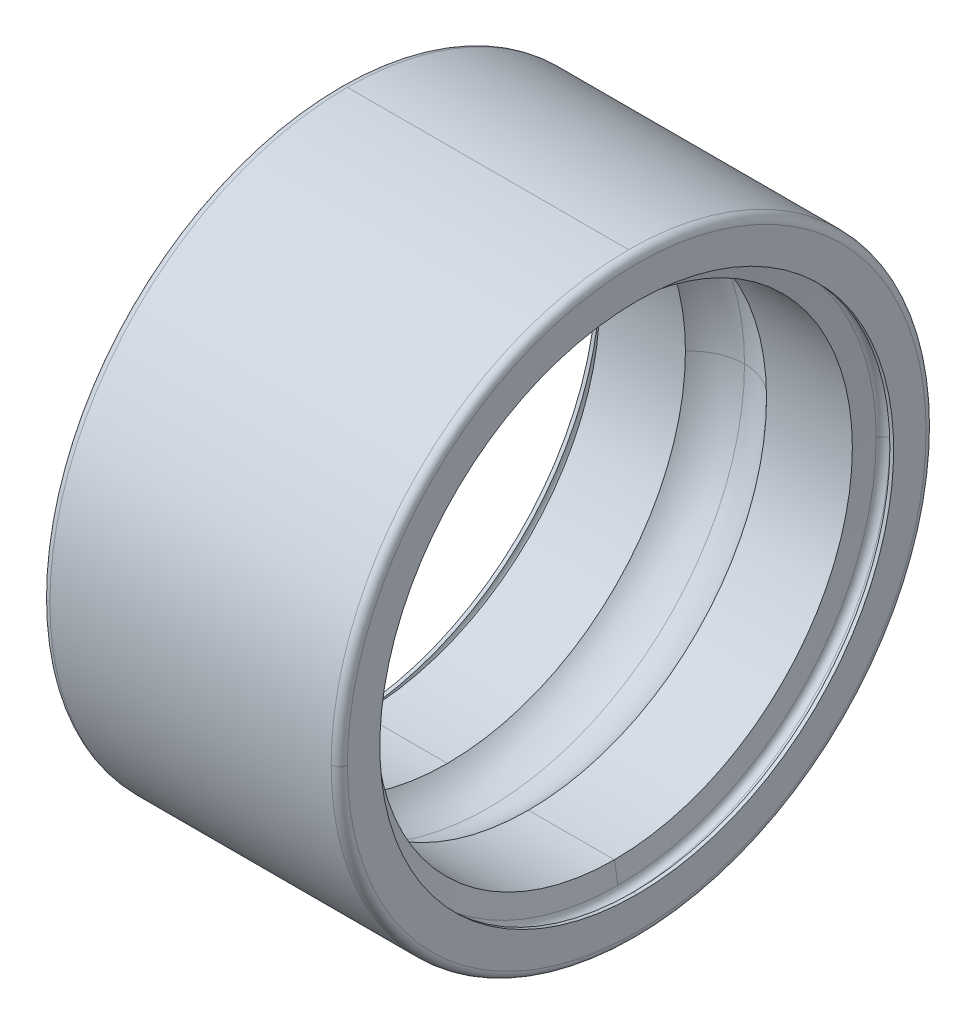
ISO-10303-21;
HEADER;
FILE_DESCRIPTION(('STEP AP214'),'2;1');
FILE_NAME('part.step','',(''),(''),'','','');
FILE_SCHEMA(('AUTOMOTIVE_DESIGN { 1 0 10303 214 1 1 1 1 }'));
ENDSEC;
DATA;
#1=APPLICATION_CONTEXT('core data for automotive mechanical design processes');
#2=APPLICATION_PROTOCOL_DEFINITION('international standard','automotive_design',2000,#1);
#3=PRODUCT_CONTEXT('',#1,'mechanical');
#4=PRODUCT('Part','Part','',(#3));
#5=PRODUCT_RELATED_PRODUCT_CATEGORY('part','',(#4));
#6=PRODUCT_DEFINITION_FORMATION('','',#4);
#7=PRODUCT_DEFINITION_CONTEXT('part definition',#1,'design');
#8=PRODUCT_DEFINITION('design','',#6,#7);
#9=PRODUCT_DEFINITION_SHAPE('','',#8);
#10=(LENGTH_UNIT() NAMED_UNIT(*) SI_UNIT(.MILLI.,.METRE.));
#11=(NAMED_UNIT(*) PLANE_ANGLE_UNIT() SI_UNIT($,.RADIAN.));
#12=(NAMED_UNIT(*) SI_UNIT($,.STERADIAN.) SOLID_ANGLE_UNIT());
#13=UNCERTAINTY_MEASURE_WITH_UNIT(LENGTH_MEASURE(1.E-05),#10,'distance_accuracy_value','');
#14=(GEOMETRIC_REPRESENTATION_CONTEXT(3) GLOBAL_UNCERTAINTY_ASSIGNED_CONTEXT((#13)) GLOBAL_UNIT_ASSIGNED_CONTEXT((#10,
#11,#12)) REPRESENTATION_CONTEXT('',''));
#15=CARTESIAN_POINT('',(0.,0.,0.));
#16=DIRECTION('',(0.,0.,1.));
#17=DIRECTION('',(1.,0.,0.));
#18=AXIS2_PLACEMENT_3D('',#15,#16,#17);
#19=CARTESIAN_POINT('',(10.58,0.,0.));
#20=DIRECTION('',(1.,0.,0.));
#21=DIRECTION('',(0.,0.,-1.));
#22=AXIS2_PLACEMENT_3D('',#19,#20,#21);
#23=TOROIDAL_SURFACE('',#22,9.5,0.28);
#24=CARTESIAN_POINT('',(10.58,0.,0.));
#25=DIRECTION('',(1.,0.,0.));
#26=DIRECTION('',(0.,0.,1.));
#27=AXIS2_PLACEMENT_3D('',#24,#25,#26);
#28=CIRCLE('',#27,9.78);
#29=CARTESIAN_POINT('',(10.58,0.,-9.78));
#30=VERTEX_POINT('',#29);
#31=CARTESIAN_POINT('',(10.58,0.,9.78));
#32=VERTEX_POINT('',#31);
#33=EDGE_CURVE('E398',#30,#32,#28,.T.);
#34=ORIENTED_EDGE('',*,*,#33,.T.);
#35=CARTESIAN_POINT('',(10.58,0.,9.5));
#36=DIRECTION('',(0.,-1.,0.));
#37=DIRECTION('',(0.,0.,1.));
#38=AXIS2_PLACEMENT_3D('',#35,#36,#37);
#39=CIRCLE('',#38,0.28);
#40=CARTESIAN_POINT('',(10.3042538291566,0.,9.54862148974674));
#41=VERTEX_POINT('',#40);
#42=EDGE_CURVE('E255',#32,#41,#39,.T.);
#43=ORIENTED_EDGE('',*,*,#42,.T.);
#44=CARTESIAN_POINT('',(10.3042538291566,0.,0.));
#45=DIRECTION('',(1.,0.,0.));
#46=DIRECTION('',(0.,1.,0.));
#47=AXIS2_PLACEMENT_3D('',#44,#45,#46);
#48=CIRCLE('',#47,9.54862148974674);
#49=CARTESIAN_POINT('',(10.3042538291566,9.54862148974674,0.));
#50=VERTEX_POINT('',#49);
#51=EDGE_CURVE('E31',#50,#41,#48,.T.);
#52=ORIENTED_EDGE('',*,*,#51,.F.);
#53=CARTESIAN_POINT('',(10.3042538291566,0.,0.));
#54=DIRECTION('',(1.,0.,0.));
#55=DIRECTION('',(0.,1.,0.));
#56=AXIS2_PLACEMENT_3D('',#53,#54,#55);
#57=CIRCLE('',#56,9.54862148974674);
#58=CARTESIAN_POINT('',(10.3042538291566,0.,-9.54862148974674));
#59=VERTEX_POINT('',#58);
#60=EDGE_CURVE('E201',#59,#50,#57,.T.);
#61=ORIENTED_EDGE('',*,*,#60,.F.);
#62=CARTESIAN_POINT('',(10.58,0.,-9.5));
#63=DIRECTION('',(0.,-1.,0.));
#64=DIRECTION('',(0.,0.,-1.));
#65=AXIS2_PLACEMENT_3D('',#62,#63,#64);
#66=CIRCLE('',#65,0.28);
#67=EDGE_CURVE('E380',#59,#30,#66,.T.);
#68=ORIENTED_EDGE('',*,*,#67,.T.);
#69=EDGE_LOOP('',(#34,#43,#52,#61,#68));
#70=FACE_BOUND('',#69,.T.);
#71=ADVANCED_FACE('F15',(#70),#23,.F.);
#72=CARTESIAN_POINT('',(10.93,0.,0.));
#73=DIRECTION('',(1.,0.,0.));
#74=DIRECTION('',(0.,1.,0.));
#75=AXIS2_PLACEMENT_3D('',#72,#73,#74);
#76=CYLINDRICAL_SURFACE('',#75,9.5);
#77=DIRECTION('',(1.,0.,0.));
#78=VECTOR('',#77,1.);
#79=CARTESIAN_POINT('',(10.93,9.5,0.));
#80=LINE('',#79,#78);
#81=CARTESIAN_POINT('',(10.86,9.5,0.));
#82=VERTEX_POINT('',#81);
#83=CARTESIAN_POINT('',(11.,9.5,0.));
#84=VERTEX_POINT('',#83);
#85=EDGE_CURVE('E257',#82,#84,#80,.T.);
#86=ORIENTED_EDGE('',*,*,#85,.T.);
#87=CARTESIAN_POINT('',(11.,0.,0.));
#88=DIRECTION('',(1.,0.,0.));
#89=DIRECTION('',(0.,1.,0.));
#90=AXIS2_PLACEMENT_3D('',#87,#88,#89);
#91=CIRCLE('',#90,9.5);
#92=CARTESIAN_POINT('',(11.,-9.5,0.));
#93=VERTEX_POINT('',#92);
#94=EDGE_CURVE('E10',#84,#93,#91,.T.);
#95=ORIENTED_EDGE('',*,*,#94,.T.);
#96=DIRECTION('',(-1.,0.,0.));
#97=VECTOR('',#96,1.);
#98=CARTESIAN_POINT('',(10.93,-9.5,0.));
#99=LINE('',#98,#97);
#100=CARTESIAN_POINT('',(10.86,-9.5,0.));
#101=VERTEX_POINT('',#100);
#102=EDGE_CURVE('E259',#93,#101,#99,.T.);
#103=ORIENTED_EDGE('',*,*,#102,.T.);
#104=CARTESIAN_POINT('',(10.86,0.,0.));
#105=DIRECTION('',(1.,0.,0.));
#106=DIRECTION('',(0.,1.,0.));
#107=AXIS2_PLACEMENT_3D('',#104,#105,#106);
#108=CIRCLE('',#107,9.5);
#109=CARTESIAN_POINT('',(10.86,0.,9.5));
#110=VERTEX_POINT('',#109);
#111=EDGE_CURVE('E373',#110,#101,#108,.T.);
#112=ORIENTED_EDGE('',*,*,#111,.F.);
#113=CARTESIAN_POINT('',(10.86,0.,0.));
#114=DIRECTION('',(1.,0.,0.));
#115=DIRECTION('',(0.,1.,0.));
#116=AXIS2_PLACEMENT_3D('',#113,#114,#115);
#117=CIRCLE('',#116,9.5);
#118=EDGE_CURVE('E458',#82,#110,#117,.T.);
#119=ORIENTED_EDGE('',*,*,#118,.F.);
#120=EDGE_LOOP('',(#86,#95,#103,#112,#119));
#121=FACE_BOUND('',#120,.T.);
#122=ADVANCED_FACE('F486',(#121),#76,.F.);
#123=CARTESIAN_POINT('',(11.,10.1,0.));
#124=DIRECTION('',(1.,0.,0.));
#125=DIRECTION('',(0.,1.,0.));
#126=AXIS2_PLACEMENT_3D('',#123,#124,#125);
#127=PLANE('',#126);
#128=ORIENTED_EDGE('',*,*,#94,.F.);
#129=CARTESIAN_POINT('',(11.,0.,0.));
#130=DIRECTION('',(1.,0.,0.));
#131=DIRECTION('',(0.,1.,0.));
#132=AXIS2_PLACEMENT_3D('',#129,#130,#131);
#133=CIRCLE('',#132,9.5);
#134=EDGE_CURVE('E262',#93,#84,#133,.T.);
#135=ORIENTED_EDGE('',*,*,#134,.F.);
#136=EDGE_LOOP('',(#128,#135));
#137=FACE_BOUND('',#136,.T.);
#138=CARTESIAN_POINT('',(11.,0.,0.));
#139=DIRECTION('',(1.,0.,0.));
#140=DIRECTION('',(0.,1.,0.));
#141=AXIS2_PLACEMENT_3D('',#138,#139,#140);
#142=CIRCLE('',#141,10.7);
#143=CARTESIAN_POINT('',(11.,0.,10.7));
#144=VERTEX_POINT('',#143);
#145=CARTESIAN_POINT('',(11.,0.,-10.7));
#146=VERTEX_POINT('',#145);
#147=EDGE_CURVE('E23',#144,#146,#142,.T.);
#148=ORIENTED_EDGE('',*,*,#147,.T.);
#149=CARTESIAN_POINT('',(11.,0.,0.));
#150=DIRECTION('',(1.,0.,0.));
#151=DIRECTION('',(0.,1.,0.));
#152=AXIS2_PLACEMENT_3D('',#149,#150,#151);
#153=CIRCLE('',#152,10.7);
#154=EDGE_CURVE('E278',#146,#144,#153,.T.);
#155=ORIENTED_EDGE('',*,*,#154,.T.);
#156=EDGE_LOOP('',(#148,#155));
#157=FACE_BOUND('',#156,.T.);
#158=ADVANCED_FACE('F315',(#137,#157),#127,.T.);
#159=CARTESIAN_POINT('',(10.7,0.,0.));
#160=DIRECTION('',(1.,0.,0.));
#161=DIRECTION('',(0.,0.,-1.));
#162=AXIS2_PLACEMENT_3D('',#159,#160,#161);
#163=TOROIDAL_SURFACE('',#162,10.7,0.3);
#164=CARTESIAN_POINT('',(10.7,0.,-10.7));
#165=DIRECTION('',(0.,-1.,0.));
#166=DIRECTION('',(0.,0.,-1.));
#167=AXIS2_PLACEMENT_3D('',#164,#165,#166);
#168=CIRCLE('',#167,0.3);
#169=CARTESIAN_POINT('',(10.7,0.,-11.));
#170=VERTEX_POINT('',#169);
#171=EDGE_CURVE('E265',#170,#146,#168,.T.);
#172=ORIENTED_EDGE('',*,*,#171,.T.);
#173=ORIENTED_EDGE('',*,*,#147,.F.);
#174=CARTESIAN_POINT('',(10.7,0.,10.7));
#175=DIRECTION('',(0.,-1.,0.));
#176=DIRECTION('',(0.,0.,1.));
#177=AXIS2_PLACEMENT_3D('',#174,#175,#176);
#178=CIRCLE('',#177,0.3);
#179=CARTESIAN_POINT('',(10.7,0.,11.));
#180=VERTEX_POINT('',#179);
#181=EDGE_CURVE('E275',#144,#180,#178,.T.);
#182=ORIENTED_EDGE('',*,*,#181,.T.);
#183=CARTESIAN_POINT('',(10.7,0.,0.));
#184=DIRECTION('',(1.,0.,0.));
#185=DIRECTION('',(0.,1.,0.));
#186=AXIS2_PLACEMENT_3D('',#183,#184,#185);
#187=CIRCLE('',#186,11.);
#188=CARTESIAN_POINT('',(10.7,-11.,0.));
#189=VERTEX_POINT('',#188);
#190=EDGE_CURVE('E289',#180,#189,#187,.T.);
#191=ORIENTED_EDGE('',*,*,#190,.T.);
#192=CARTESIAN_POINT('',(10.7,0.,0.));
#193=DIRECTION('',(1.,0.,0.));
#194=DIRECTION('',(0.,1.,0.));
#195=AXIS2_PLACEMENT_3D('',#192,#193,#194);
#196=CIRCLE('',#195,11.);
#197=EDGE_CURVE('E18',#189,#170,#196,.T.);
#198=ORIENTED_EDGE('',*,*,#197,.T.);
#199=EDGE_LOOP('',(#172,#173,#182,#191,#198));
#200=FACE_BOUND('',#199,.T.);
#201=ADVANCED_FACE('F313',(#200),#163,.T.);
#202=CARTESIAN_POINT('',(5.5,0.,0.));
#203=DIRECTION('',(1.,0.,0.));
#204=DIRECTION('',(0.,1.,0.));
#205=AXIS2_PLACEMENT_3D('',#202,#203,#204);
#206=CYLINDRICAL_SURFACE('',#205,11.);
#207=DIRECTION('',(1.,0.,0.));
#208=VECTOR('',#207,1.);
#209=CARTESIAN_POINT('',(5.5,11.,0.));
#210=LINE('',#209,#208);
#211=CARTESIAN_POINT('',(0.3,11.,0.));
#212=VERTEX_POINT('',#211);
#213=CARTESIAN_POINT('',(10.7,11.,0.));
#214=VERTEX_POINT('',#213);
#215=EDGE_CURVE('E279',#212,#214,#210,.T.);
#216=ORIENTED_EDGE('',*,*,#215,.T.);
#217=CARTESIAN_POINT('',(10.7,0.,0.));
#218=DIRECTION('',(1.,0.,0.));
#219=DIRECTION('',(0.,1.,0.));
#220=AXIS2_PLACEMENT_3D('',#217,#218,#219);
#221=CIRCLE('',#220,11.);
#222=EDGE_CURVE('E269',#170,#214,#221,.T.);
#223=ORIENTED_EDGE('',*,*,#222,.F.);
#224=ORIENTED_EDGE('',*,*,#197,.F.);
#225=DIRECTION('',(-1.,0.,0.));
#226=VECTOR('',#225,1.);
#227=CARTESIAN_POINT('',(5.5,-11.,0.));
#228=LINE('',#227,#226);
#229=CARTESIAN_POINT('',(0.3,-11.,0.));
#230=VERTEX_POINT('',#229);
#231=EDGE_CURVE('E287',#189,#230,#228,.T.);
#232=ORIENTED_EDGE('',*,*,#231,.T.);
#233=CARTESIAN_POINT('',(0.3,0.,0.));
#234=DIRECTION('',(1.,0.,0.));
#235=DIRECTION('',(0.,1.,0.));
#236=AXIS2_PLACEMENT_3D('',#233,#234,#235);
#237=CIRCLE('',#236,11.);
#238=CARTESIAN_POINT('',(0.3,0.,-11.));
#239=VERTEX_POINT('',#238);
#240=EDGE_CURVE('E210',#230,#239,#237,.T.);
#241=ORIENTED_EDGE('',*,*,#240,.T.);
#242=CARTESIAN_POINT('',(0.3,0.,0.));
#243=DIRECTION('',(1.,0.,0.));
#244=DIRECTION('',(0.,1.,0.));
#245=AXIS2_PLACEMENT_3D('',#242,#243,#244);
#246=CIRCLE('',#245,11.);
#247=EDGE_CURVE('E226',#239,#212,#246,.T.);
#248=ORIENTED_EDGE('',*,*,#247,.T.);
#249=EDGE_LOOP('',(#216,#223,#224,#232,#241,#248));
#250=FACE_BOUND('',#249,.T.);
#251=ADVANCED_FACE('F302',(#250),#206,.T.);
#252=CARTESIAN_POINT('',(0.3,0.,0.));
#253=DIRECTION('',(1.,0.,0.));
#254=DIRECTION('',(0.,0.,-1.));
#255=AXIS2_PLACEMENT_3D('',#252,#253,#254);
#256=TOROIDAL_SURFACE('',#255,10.7,0.3);
#257=CARTESIAN_POINT('',(0.3,0.,-10.7));
#258=DIRECTION('',(0.,-1.,0.));
#259=DIRECTION('',(0.,0.,-1.));
#260=AXIS2_PLACEMENT_3D('',#257,#258,#259);
#261=CIRCLE('',#260,0.3);
#262=CARTESIAN_POINT('',(0.,0.,-10.7));
#263=VERTEX_POINT('',#262);
#264=EDGE_CURVE('E219',#263,#239,#261,.T.);
#265=ORIENTED_EDGE('',*,*,#264,.T.);
#266=ORIENTED_EDGE('',*,*,#240,.F.);
#267=CARTESIAN_POINT('',(0.3,0.,0.));
#268=DIRECTION('',(1.,0.,0.));
#269=DIRECTION('',(0.,1.,0.));
#270=AXIS2_PLACEMENT_3D('',#267,#268,#269);
#271=CIRCLE('',#270,11.);
#272=CARTESIAN_POINT('',(0.3,0.,11.));
#273=VERTEX_POINT('',#272);
#274=EDGE_CURVE('E284',#273,#230,#271,.T.);
#275=ORIENTED_EDGE('',*,*,#274,.F.);
#276=CARTESIAN_POINT('',(0.3,0.,10.7));
#277=DIRECTION('',(0.,-1.,0.));
#278=DIRECTION('',(0.,0.,1.));
#279=AXIS2_PLACEMENT_3D('',#276,#277,#278);
#280=CIRCLE('',#279,0.3);
#281=CARTESIAN_POINT('',(0.,0.,10.7));
#282=VERTEX_POINT('',#281);
#283=EDGE_CURVE('E224',#273,#282,#280,.T.);
#284=ORIENTED_EDGE('',*,*,#283,.T.);
#285=CARTESIAN_POINT('',(0.,0.,0.));
#286=DIRECTION('',(1.,0.,0.));
#287=DIRECTION('',(0.,1.,0.));
#288=AXIS2_PLACEMENT_3D('',#285,#286,#287);
#289=CIRCLE('',#288,10.7);
#290=EDGE_CURVE('E206',#282,#263,#289,.T.);
#291=ORIENTED_EDGE('',*,*,#290,.T.);
#292=EDGE_LOOP('',(#265,#266,#275,#284,#291));
#293=FACE_BOUND('',#292,.T.);
#294=ADVANCED_FACE('F294',(#293),#256,.T.);
#295=CARTESIAN_POINT('',(0.,10.1,0.));
#296=DIRECTION('',(-1.,0.,0.));
#297=DIRECTION('',(0.,0.,1.));
#298=AXIS2_PLACEMENT_3D('',#295,#296,#297);
#299=PLANE('',#298);
#300=CARTESIAN_POINT('',(0.,0.,0.));
#301=DIRECTION('',(1.,0.,0.));
#302=DIRECTION('',(0.,1.,0.));
#303=AXIS2_PLACEMENT_3D('',#300,#301,#302);
#304=CIRCLE('',#303,9.5);
#305=CARTESIAN_POINT('',(0.,9.5,0.));
#306=VERTEX_POINT('',#305);
#307=CARTESIAN_POINT('',(0.,-9.5,0.));
#308=VERTEX_POINT('',#307);
#309=EDGE_CURVE('E205',#306,#308,#304,.T.);
#310=ORIENTED_EDGE('',*,*,#309,.T.);
#311=CARTESIAN_POINT('',(0.,0.,0.));
#312=DIRECTION('',(1.,0.,0.));
#313=DIRECTION('',(0.,1.,0.));
#314=AXIS2_PLACEMENT_3D('',#311,#312,#313);
#315=CIRCLE('',#314,9.5);
#316=EDGE_CURVE('E231',#308,#306,#315,.T.);
#317=ORIENTED_EDGE('',*,*,#316,.T.);
#318=EDGE_LOOP('',(#310,#317));
#319=FACE_BOUND('',#318,.T.);
#320=CARTESIAN_POINT('',(0.,0.,0.));
#321=DIRECTION('',(1.,0.,0.));
#322=DIRECTION('',(0.,1.,0.));
#323=AXIS2_PLACEMENT_3D('',#320,#321,#322);
#324=CIRCLE('',#323,10.7);
#325=EDGE_CURVE('E221',#263,#282,#324,.T.);
#326=ORIENTED_EDGE('',*,*,#325,.F.);
#327=ORIENTED_EDGE('',*,*,#290,.F.);
#328=EDGE_LOOP('',(#326,#327));
#329=FACE_BOUND('',#328,.T.);
#330=ADVANCED_FACE('F513',(#319,#329),#299,.T.);
#331=CARTESIAN_POINT('',(0.07,0.,0.));
#332=DIRECTION('',(1.,0.,0.));
#333=DIRECTION('',(0.,1.,0.));
#334=AXIS2_PLACEMENT_3D('',#331,#332,#333);
#335=CYLINDRICAL_SURFACE('',#334,9.5);
#336=DIRECTION('',(1.,0.,0.));
#337=VECTOR('',#336,1.);
#338=CARTESIAN_POINT('',(0.07,9.5,0.));
#339=LINE('',#338,#337);
#340=CARTESIAN_POINT('',(0.14,9.5,0.));
#341=VERTEX_POINT('',#340);
#342=EDGE_CURVE('E228',#306,#341,#339,.T.);
#343=ORIENTED_EDGE('',*,*,#342,.T.);
#344=CARTESIAN_POINT('',(0.14,0.,0.));
#345=DIRECTION('',(1.,0.,0.));
#346=DIRECTION('',(0.,1.,0.));
#347=AXIS2_PLACEMENT_3D('',#344,#345,#346);
#348=CIRCLE('',#347,9.5);
#349=CARTESIAN_POINT('',(0.14,0.,9.5));
#350=VERTEX_POINT('',#349);
#351=EDGE_CURVE('E204',#341,#350,#348,.T.);
#352=ORIENTED_EDGE('',*,*,#351,.T.);
#353=CARTESIAN_POINT('',(0.14,0.,0.));
#354=DIRECTION('',(1.,0.,0.));
#355=DIRECTION('',(0.,1.,0.));
#356=AXIS2_PLACEMENT_3D('',#353,#354,#355);
#357=CIRCLE('',#356,9.5);
#358=CARTESIAN_POINT('',(0.14,-9.5,0.));
#359=VERTEX_POINT('',#358);
#360=EDGE_CURVE('E240',#350,#359,#357,.T.);
#361=ORIENTED_EDGE('',*,*,#360,.T.);
#362=DIRECTION('',(-1.,0.,0.));
#363=VECTOR('',#362,1.);
#364=CARTESIAN_POINT('',(0.07,-9.5,0.));
#365=LINE('',#364,#363);
#366=EDGE_CURVE('E235',#359,#308,#365,.T.);
#367=ORIENTED_EDGE('',*,*,#366,.T.);
#368=ORIENTED_EDGE('',*,*,#309,.F.);
#369=EDGE_LOOP('',(#343,#352,#361,#367,#368));
#370=FACE_BOUND('',#369,.T.);
#371=ADVANCED_FACE('F516',(#370),#335,.F.);
#372=CARTESIAN_POINT('',(0.42,0.,0.));
#373=DIRECTION('',(1.,0.,0.));
#374=DIRECTION('',(0.,0.,-1.));
#375=AXIS2_PLACEMENT_3D('',#372,#373,#374);
#376=TOROIDAL_SURFACE('',#375,9.5,0.28);
#377=CARTESIAN_POINT('',(0.42,0.,0.));
#378=DIRECTION('',(1.,0.,0.));
#379=DIRECTION('',(0.,0.,1.));
#380=AXIS2_PLACEMENT_3D('',#377,#378,#379);
#381=CIRCLE('',#380,9.78);
#382=CARTESIAN_POINT('',(0.42,0.,-9.78));
#383=VERTEX_POINT('',#382);
#384=CARTESIAN_POINT('',(0.42,0.,9.78));
#385=VERTEX_POINT('',#384);
#386=EDGE_CURVE('E321',#383,#385,#381,.T.);
#387=ORIENTED_EDGE('',*,*,#386,.T.);
#388=CARTESIAN_POINT('',(0.42,0.,9.5));
#389=DIRECTION('',(0.,-1.,0.));
#390=DIRECTION('',(0.,0.,1.));
#391=AXIS2_PLACEMENT_3D('',#388,#389,#390);
#392=CIRCLE('',#391,0.28);
#393=EDGE_CURVE('E242',#385,#350,#392,.T.);
#394=ORIENTED_EDGE('',*,*,#393,.T.);
#395=ORIENTED_EDGE('',*,*,#351,.F.);
#396=CARTESIAN_POINT('',(0.14,0.,0.));
#397=DIRECTION('',(1.,0.,0.));
#398=DIRECTION('',(0.,1.,0.));
#399=AXIS2_PLACEMENT_3D('',#396,#397,#398);
#400=CIRCLE('',#399,9.5);
#401=CARTESIAN_POINT('',(0.14,0.,-9.5));
#402=VERTEX_POINT('',#401);
#403=EDGE_CURVE('E234',#402,#341,#400,.T.);
#404=ORIENTED_EDGE('',*,*,#403,.F.);
#405=CARTESIAN_POINT('',(0.42,0.,-9.5));
#406=DIRECTION('',(0.,-1.,0.));
#407=DIRECTION('',(0.,0.,-1.));
#408=AXIS2_PLACEMENT_3D('',#405,#406,#407);
#409=CIRCLE('',#408,0.28);
#410=EDGE_CURVE('E237',#402,#383,#409,.T.);
#411=ORIENTED_EDGE('',*,*,#410,.T.);
#412=EDGE_LOOP('',(#387,#394,#395,#404,#411));
#413=FACE_BOUND('',#412,.T.);
#414=ADVANCED_FACE('F448',(#413),#376,.F.);
#415=CARTESIAN_POINT('',(0.761747254333676,0.,0.));
#416=DIRECTION('',(-1.,0.,0.));
#417=DIRECTION('',(0.,1.,0.));
#418=AXIS2_PLACEMENT_3D('',#415,#416,#417);
#419=CONICAL_SURFACE('',#418,9.17431074487337,1.39626340159546);
#420=DIRECTION('',(0.17364817766693,-0.984807753012208,0.));
#421=VECTOR('',#420,1.);
#422=CARTESIAN_POINT('',(0.761747254333676,9.17431074487337,0.));
#423=LINE('',#422,#421);
#424=CARTESIAN_POINT('',(0.695746170843417,9.54862148974674,0.));
#425=VERTEX_POINT('',#424);
#426=CARTESIAN_POINT('',(0.827748337823933,8.8,0.));
#427=VERTEX_POINT('',#426);
#428=EDGE_CURVE('E243',#425,#427,#423,.T.);
#429=ORIENTED_EDGE('',*,*,#428,.T.);
#430=CARTESIAN_POINT('',(0.827748337823932,0.,0.));
#431=DIRECTION('',(1.,0.,0.));
#432=DIRECTION('',(0.,1.,0.));
#433=AXIS2_PLACEMENT_3D('',#430,#431,#432);
#434=CIRCLE('',#433,8.8);
#435=CARTESIAN_POINT('',(0.827748337823932,-8.8,0.));
#436=VERTEX_POINT('',#435);
#437=EDGE_CURVE('E168',#427,#436,#434,.T.);
#438=ORIENTED_EDGE('',*,*,#437,.T.);
#439=DIRECTION('',(-0.17364817766693,-0.984807753012208,0.));
#440=VECTOR('',#439,1.);
#441=CARTESIAN_POINT('',(0.761747254333676,-9.17431074487337,0.));
#442=LINE('',#441,#440);
#443=CARTESIAN_POINT('',(0.695746170843417,-9.54862148974674,0.));
#444=VERTEX_POINT('',#443);
#445=EDGE_CURVE('E246',#436,#444,#442,.T.);
#446=ORIENTED_EDGE('',*,*,#445,.T.);
#447=CARTESIAN_POINT('',(0.695746170843417,0.,0.));
#448=DIRECTION('',(1.,0.,0.));
#449=DIRECTION('',(0.,1.,0.));
#450=AXIS2_PLACEMENT_3D('',#447,#448,#449);
#451=CIRCLE('',#450,9.54862148974674);
#452=CARTESIAN_POINT('',(0.695746170843417,0.,9.54862148974674));
#453=VERTEX_POINT('',#452);
#454=EDGE_CURVE('E362',#453,#444,#451,.T.);
#455=ORIENTED_EDGE('',*,*,#454,.F.);
#456=CARTESIAN_POINT('',(0.695746170843417,0.,0.));
#457=DIRECTION('',(1.,0.,0.));
#458=DIRECTION('',(0.,1.,0.));
#459=AXIS2_PLACEMENT_3D('',#456,#457,#458);
#460=CIRCLE('',#459,9.54862148974674);
#461=EDGE_CURVE('E333',#425,#453,#460,.T.);
#462=ORIENTED_EDGE('',*,*,#461,.F.);
#463=EDGE_LOOP('',(#429,#438,#446,#455,#462));
#464=FACE_BOUND('',#463,.T.);
#465=ADVANCED_FACE('F453',(#464),#419,.F.);
#466=CARTESIAN_POINT('',(2.41416751794774,0.,0.));
#467=DIRECTION('',(1.,0.,0.));
#468=DIRECTION('',(0.,1.,0.));
#469=AXIS2_PLACEMENT_3D('',#466,#467,#468);
#470=CYLINDRICAL_SURFACE('',#469,8.8);
#471=DIRECTION('',(1.,0.,0.));
#472=VECTOR('',#471,1.);
#473=CARTESIAN_POINT('',(2.41416751794774,8.8,0.));
#474=LINE('',#473,#472);
#475=CARTESIAN_POINT('',(4.00058669807154,8.8,0.));
#476=VERTEX_POINT('',#475);
#477=EDGE_CURVE('E164',#427,#476,#474,.T.);
#478=ORIENTED_EDGE('',*,*,#477,.T.);
#479=CARTESIAN_POINT('',(4.00058669807154,0.,0.));
#480=DIRECTION('',(1.,0.,0.));
#481=DIRECTION('',(0.,1.,0.));
#482=AXIS2_PLACEMENT_3D('',#479,#480,#481);
#483=CIRCLE('',#482,8.8);
#484=CARTESIAN_POINT('',(4.00058669807154,0.,8.8));
#485=VERTEX_POINT('',#484);
#486=EDGE_CURVE('E156',#476,#485,#483,.T.);
#487=ORIENTED_EDGE('',*,*,#486,.T.);
#488=CARTESIAN_POINT('',(4.00058669807154,0.,0.));
#489=DIRECTION('',(1.,0.,0.));
#490=DIRECTION('',(0.,1.,0.));
#491=AXIS2_PLACEMENT_3D('',#488,#489,#490);
#492=CIRCLE('',#491,8.8);
#493=CARTESIAN_POINT('',(4.00058669807154,-8.8,0.));
#494=VERTEX_POINT('',#493);
#495=EDGE_CURVE('E161',#485,#494,#492,.T.);
#496=ORIENTED_EDGE('',*,*,#495,.T.);
#497=DIRECTION('',(-1.,0.,0.));
#498=VECTOR('',#497,1.);
#499=CARTESIAN_POINT('',(2.41416751794774,-8.8,0.));
#500=LINE('',#499,#498);
#501=EDGE_CURVE('E247',#494,#436,#500,.T.);
#502=ORIENTED_EDGE('',*,*,#501,.T.);
#503=ORIENTED_EDGE('',*,*,#437,.F.);
#504=EDGE_LOOP('',(#478,#487,#496,#502,#503));
#505=FACE_BOUND('',#504,.T.);
#506=ADVANCED_FACE('F158',(#505),#470,.F.);
#507=CARTESIAN_POINT('',(5.5,0.,0.));
#508=DIRECTION('',(1.,0.,0.));
#509=DIRECTION('',(0.,0.,-1.));
#510=AXIS2_PLACEMENT_3D('',#507,#508,#509);
#511=TOROIDAL_SURFACE('',#510,7.5,1.9845);
#512=CARTESIAN_POINT('',(5.5,0.,0.));
#513=DIRECTION('',(1.,0.,0.));
#514=DIRECTION('',(0.,0.,1.));
#515=AXIS2_PLACEMENT_3D('',#512,#513,#514);
#516=CIRCLE('',#515,9.4845);
#517=CARTESIAN_POINT('',(5.5,0.,-9.4845));
#518=VERTEX_POINT('',#517);
#519=CARTESIAN_POINT('',(5.5,0.,9.4845));
#520=VERTEX_POINT('',#519);
#521=EDGE_CURVE('E176',#518,#520,#516,.T.);
#522=ORIENTED_EDGE('',*,*,#521,.T.);
#523=CARTESIAN_POINT('',(5.5,0.,7.5));
#524=DIRECTION('',(0.,-1.,0.));
#525=DIRECTION('',(0.,0.,1.));
#526=AXIS2_PLACEMENT_3D('',#523,#524,#525);
#527=CIRCLE('',#526,1.9845);
#528=EDGE_CURVE('E172',#520,#485,#527,.T.);
#529=ORIENTED_EDGE('',*,*,#528,.T.);
#530=ORIENTED_EDGE('',*,*,#486,.F.);
#531=CARTESIAN_POINT('',(4.00058669807154,0.,0.));
#532=DIRECTION('',(1.,0.,0.));
#533=DIRECTION('',(0.,1.,0.));
#534=AXIS2_PLACEMENT_3D('',#531,#532,#533);
#535=CIRCLE('',#534,8.8);
#536=CARTESIAN_POINT('',(4.00058669807154,0.,-8.8));
#537=VERTEX_POINT('',#536);
#538=EDGE_CURVE('E188',#537,#476,#535,.T.);
#539=ORIENTED_EDGE('',*,*,#538,.F.);
#540=CARTESIAN_POINT('',(5.5,0.,-7.5));
#541=DIRECTION('',(0.,-1.,0.));
#542=DIRECTION('',(0.,0.,-1.));
#543=AXIS2_PLACEMENT_3D('',#540,#541,#542);
#544=CIRCLE('',#543,1.9845);
#545=EDGE_CURVE('E186',#537,#518,#544,.T.);
#546=ORIENTED_EDGE('',*,*,#545,.T.);
#547=EDGE_LOOP('',(#522,#529,#530,#539,#546));
#548=FACE_BOUND('',#547,.T.);
#549=ADVANCED_FACE('F173',(#548),#511,.F.);
#550=CARTESIAN_POINT('',(8.58583248205226,0.,0.));
#551=DIRECTION('',(1.,0.,0.));
#552=DIRECTION('',(0.,1.,0.));
#553=AXIS2_PLACEMENT_3D('',#550,#551,#552);
#554=CYLINDRICAL_SURFACE('',#553,8.8);
#555=DIRECTION('',(1.,0.,0.));
#556=VECTOR('',#555,1.);
#557=CARTESIAN_POINT('',(8.58583248205226,8.8,0.));
#558=LINE('',#557,#556);
#559=CARTESIAN_POINT('',(6.99941330192846,8.8,0.));
#560=VERTEX_POINT('',#559);
#561=CARTESIAN_POINT('',(10.1722516621761,8.8,0.));
#562=VERTEX_POINT('',#561);
#563=EDGE_CURVE('E180',#560,#562,#558,.T.);
#564=ORIENTED_EDGE('',*,*,#563,.T.);
#565=CARTESIAN_POINT('',(10.1722516621761,0.,0.));
#566=DIRECTION('',(1.,0.,0.));
#567=DIRECTION('',(0.,1.,0.));
#568=AXIS2_PLACEMENT_3D('',#565,#566,#567);
#569=CIRCLE('',#568,8.8);
#570=CARTESIAN_POINT('',(10.1722516621761,-8.8,0.));
#571=VERTEX_POINT('',#570);
#572=EDGE_CURVE('E40',#562,#571,#569,.T.);
#573=ORIENTED_EDGE('',*,*,#572,.T.);
#574=DIRECTION('',(-1.,0.,0.));
#575=VECTOR('',#574,1.);
#576=CARTESIAN_POINT('',(8.58583248205226,-8.8,0.));
#577=LINE('',#576,#575);
#578=CARTESIAN_POINT('',(6.99941330192845,-8.8,0.));
#579=VERTEX_POINT('',#578);
#580=EDGE_CURVE('E193',#571,#579,#577,.T.);
#581=ORIENTED_EDGE('',*,*,#580,.T.);
#582=CARTESIAN_POINT('',(6.99941330192846,0.,0.));
#583=DIRECTION('',(1.,0.,0.));
#584=DIRECTION('',(0.,1.,0.));
#585=AXIS2_PLACEMENT_3D('',#582,#583,#584);
#586=CIRCLE('',#585,8.8);
#587=CARTESIAN_POINT('',(6.99941330192846,0.,8.8));
#588=VERTEX_POINT('',#587);
#589=EDGE_CURVE('E353',#588,#579,#586,.T.);
#590=ORIENTED_EDGE('',*,*,#589,.F.);
#591=CARTESIAN_POINT('',(6.99941330192846,0.,0.));
#592=DIRECTION('',(1.,0.,0.));
#593=DIRECTION('',(0.,1.,0.));
#594=AXIS2_PLACEMENT_3D('',#591,#592,#593);
#595=CIRCLE('',#594,8.8);
#596=EDGE_CURVE('E344',#560,#588,#595,.T.);
#597=ORIENTED_EDGE('',*,*,#596,.F.);
#598=EDGE_LOOP('',(#564,#573,#581,#590,#597));
#599=FACE_BOUND('',#598,.T.);
#600=ADVANCED_FACE('F414',(#599),#554,.F.);
#601=CARTESIAN_POINT('',(10.2382527456663,0.,0.));
#602=DIRECTION('',(1.,0.,0.));
#603=DIRECTION('',(0.,1.,0.));
#604=AXIS2_PLACEMENT_3D('',#601,#602,#603);
#605=CONICAL_SURFACE('',#604,9.17431074487337,1.39626340159547);
#606=DIRECTION('',(0.173648177666927,0.984807753012209,0.));
#607=VECTOR('',#606,1.);
#608=CARTESIAN_POINT('',(10.2382527456663,9.17431074487337,0.));
#609=LINE('',#608,#607);
#610=EDGE_CURVE('E196',#562,#50,#609,.T.);
#611=ORIENTED_EDGE('',*,*,#610,.T.);
#612=ORIENTED_EDGE('',*,*,#51,.T.);
#613=CARTESIAN_POINT('',(10.3042538291566,0.,0.));
#614=DIRECTION('',(1.,0.,0.));
#615=DIRECTION('',(0.,1.,0.));
#616=AXIS2_PLACEMENT_3D('',#613,#614,#615);
#617=CIRCLE('',#616,9.54862148974674);
#618=CARTESIAN_POINT('',(10.3042538291566,-9.54862148974674,0.));
#619=VERTEX_POINT('',#618);
#620=EDGE_CURVE('E389',#41,#619,#617,.T.);
#621=ORIENTED_EDGE('',*,*,#620,.T.);
#622=DIRECTION('',(-0.173648177666927,0.984807753012209,0.));
#623=VECTOR('',#622,1.);
#624=CARTESIAN_POINT('',(10.2382527456663,-9.17431074487337,0.));
#625=LINE('',#624,#623);
#626=EDGE_CURVE('E199',#619,#571,#625,.T.);
#627=ORIENTED_EDGE('',*,*,#626,.T.);
#628=ORIENTED_EDGE('',*,*,#572,.F.);
#629=EDGE_LOOP('',(#611,#612,#621,#627,#628));
#630=FACE_BOUND('',#629,.T.);
#631=ADVANCED_FACE('F408',(#630),#605,.F.);
#632=CARTESIAN_POINT('',(10.2382527456663,0.,0.));
#633=DIRECTION('',(1.,0.,0.));
#634=DIRECTION('',(0.,1.,0.));
#635=AXIS2_PLACEMENT_3D('',#632,#633,#634);
#636=CONICAL_SURFACE('',#635,9.17431074487337,1.39626340159547);
#637=ORIENTED_EDGE('',*,*,#610,.F.);
#638=CARTESIAN_POINT('',(10.1722516621761,0.,0.));
#639=DIRECTION('',(1.,0.,0.));
#640=DIRECTION('',(0.,1.,0.));
#641=AXIS2_PLACEMENT_3D('',#638,#639,#640);
#642=CIRCLE('',#641,8.8);
#643=EDGE_CURVE('E195',#571,#562,#642,.T.);
#644=ORIENTED_EDGE('',*,*,#643,.F.);
#645=ORIENTED_EDGE('',*,*,#626,.F.);
#646=CARTESIAN_POINT('',(10.3042538291566,0.,0.));
#647=DIRECTION('',(1.,0.,0.));
#648=DIRECTION('',(0.,1.,0.));
#649=AXIS2_PLACEMENT_3D('',#646,#647,#648);
#650=CIRCLE('',#649,9.54862148974674);
#651=EDGE_CURVE('E385',#619,#59,#650,.T.);
#652=ORIENTED_EDGE('',*,*,#651,.T.);
#653=ORIENTED_EDGE('',*,*,#60,.T.);
#654=EDGE_LOOP('',(#637,#644,#645,#652,#653));
#655=FACE_BOUND('',#654,.T.);
#656=ADVANCED_FACE('F405',(#655),#636,.F.);
#657=CARTESIAN_POINT('',(8.58583248205226,0.,0.));
#658=DIRECTION('',(1.,0.,0.));
#659=DIRECTION('',(0.,1.,0.));
#660=AXIS2_PLACEMENT_3D('',#657,#658,#659);
#661=CYLINDRICAL_SURFACE('',#660,8.8);
#662=ORIENTED_EDGE('',*,*,#563,.F.);
#663=CARTESIAN_POINT('',(6.99941330192846,0.,0.));
#664=DIRECTION('',(1.,0.,0.));
#665=DIRECTION('',(0.,1.,0.));
#666=AXIS2_PLACEMENT_3D('',#663,#664,#665);
#667=CIRCLE('',#666,8.8);
#668=CARTESIAN_POINT('',(6.99941330192846,0.,-8.8));
#669=VERTEX_POINT('',#668);
#670=EDGE_CURVE('E319',#669,#560,#667,.T.);
#671=ORIENTED_EDGE('',*,*,#670,.F.);
#672=CARTESIAN_POINT('',(6.99941330192846,0.,0.));
#673=DIRECTION('',(1.,0.,0.));
#674=DIRECTION('',(0.,1.,0.));
#675=AXIS2_PLACEMENT_3D('',#672,#673,#674);
#676=CIRCLE('',#675,8.8);
#677=EDGE_CURVE('E356',#579,#669,#676,.T.);
#678=ORIENTED_EDGE('',*,*,#677,.F.);
#679=ORIENTED_EDGE('',*,*,#580,.F.);
#680=ORIENTED_EDGE('',*,*,#643,.T.);
#681=EDGE_LOOP('',(#662,#671,#678,#679,#680));
#682=FACE_BOUND('',#681,.T.);
#683=ADVANCED_FACE('F410',(#682),#661,.F.);
#684=CARTESIAN_POINT('',(5.5,0.,0.));
#685=DIRECTION('',(1.,0.,0.));
#686=DIRECTION('',(0.,0.,-1.));
#687=AXIS2_PLACEMENT_3D('',#684,#685,#686);
#688=TOROIDAL_SURFACE('',#687,7.5,1.9845);
#689=CARTESIAN_POINT('',(5.5,0.,0.));
#690=DIRECTION('',(1.,0.,0.));
#691=DIRECTION('',(0.,0.,1.));
#692=AXIS2_PLACEMENT_3D('',#689,#690,#691);
#693=CIRCLE('',#692,9.4845);
#694=EDGE_CURVE('E350',#520,#518,#693,.T.);
#695=ORIENTED_EDGE('',*,*,#694,.T.);
#696=ORIENTED_EDGE('',*,*,#545,.F.);
#697=CARTESIAN_POINT('',(4.00058669807154,0.,0.));
#698=DIRECTION('',(1.,0.,0.));
#699=DIRECTION('',(0.,1.,0.));
#700=AXIS2_PLACEMENT_3D('',#697,#698,#699);
#701=CIRCLE('',#700,8.8);
#702=EDGE_CURVE('E184',#494,#537,#701,.T.);
#703=ORIENTED_EDGE('',*,*,#702,.F.);
#704=ORIENTED_EDGE('',*,*,#495,.F.);
#705=ORIENTED_EDGE('',*,*,#528,.F.);
#706=EDGE_LOOP('',(#695,#696,#703,#704,#705));
#707=FACE_BOUND('',#706,.T.);
#708=ADVANCED_FACE('F182',(#707),#688,.F.);
#709=CARTESIAN_POINT('',(2.41416751794774,0.,0.));
#710=DIRECTION('',(1.,0.,0.));
#711=DIRECTION('',(0.,1.,0.));
#712=AXIS2_PLACEMENT_3D('',#709,#710,#711);
#713=CYLINDRICAL_SURFACE('',#712,8.8);
#714=ORIENTED_EDGE('',*,*,#477,.F.);
#715=CARTESIAN_POINT('',(0.827748337823932,0.,0.));
#716=DIRECTION('',(1.,0.,0.));
#717=DIRECTION('',(0.,1.,0.));
#718=AXIS2_PLACEMENT_3D('',#715,#716,#717);
#719=CIRCLE('',#718,8.8);
#720=EDGE_CURVE('E248',#436,#427,#719,.T.);
#721=ORIENTED_EDGE('',*,*,#720,.F.);
#722=ORIENTED_EDGE('',*,*,#501,.F.);
#723=ORIENTED_EDGE('',*,*,#702,.T.);
#724=ORIENTED_EDGE('',*,*,#538,.T.);
#725=EDGE_LOOP('',(#714,#721,#722,#723,#724));
#726=FACE_BOUND('',#725,.T.);
#727=ADVANCED_FACE('F454',(#726),#713,.F.);
#728=CARTESIAN_POINT('',(0.761747254333676,0.,0.));
#729=DIRECTION('',(-1.,0.,0.));
#730=DIRECTION('',(0.,1.,0.));
#731=AXIS2_PLACEMENT_3D('',#728,#729,#730);
#732=CONICAL_SURFACE('',#731,9.17431074487337,1.39626340159546);
#733=ORIENTED_EDGE('',*,*,#428,.F.);
#734=CARTESIAN_POINT('',(0.695746170843417,0.,0.));
#735=DIRECTION('',(1.,0.,0.));
#736=DIRECTION('',(0.,1.,0.));
#737=AXIS2_PLACEMENT_3D('',#734,#735,#736);
#738=CIRCLE('',#737,9.54862148974674);
#739=CARTESIAN_POINT('',(0.695746170843417,0.,-9.54862148974674));
#740=VERTEX_POINT('',#739);
#741=EDGE_CURVE('E330',#740,#425,#738,.T.);
#742=ORIENTED_EDGE('',*,*,#741,.F.);
#743=CARTESIAN_POINT('',(0.695746170843417,0.,0.));
#744=DIRECTION('',(1.,0.,0.));
#745=DIRECTION('',(0.,1.,0.));
#746=AXIS2_PLACEMENT_3D('',#743,#744,#745);
#747=CIRCLE('',#746,9.54862148974674);
#748=EDGE_CURVE('E367',#444,#740,#747,.T.);
#749=ORIENTED_EDGE('',*,*,#748,.F.);
#750=ORIENTED_EDGE('',*,*,#445,.F.);
#751=ORIENTED_EDGE('',*,*,#720,.T.);
#752=EDGE_LOOP('',(#733,#742,#749,#750,#751));
#753=FACE_BOUND('',#752,.T.);
#754=ADVANCED_FACE('F443',(#753),#732,.F.);
#755=CARTESIAN_POINT('',(0.42,0.,0.));
#756=DIRECTION('',(1.,0.,0.));
#757=DIRECTION('',(0.,0.,-1.));
#758=AXIS2_PLACEMENT_3D('',#755,#756,#757);
#759=TOROIDAL_SURFACE('',#758,9.5,0.28);
#760=CARTESIAN_POINT('',(0.42,0.,0.));
#761=DIRECTION('',(1.,0.,0.));
#762=DIRECTION('',(0.,0.,1.));
#763=AXIS2_PLACEMENT_3D('',#760,#761,#762);
#764=CIRCLE('',#763,9.78);
#765=EDGE_CURVE('E359',#385,#383,#764,.T.);
#766=ORIENTED_EDGE('',*,*,#765,.T.);
#767=ORIENTED_EDGE('',*,*,#410,.F.);
#768=CARTESIAN_POINT('',(0.14,0.,0.));
#769=DIRECTION('',(1.,0.,0.));
#770=DIRECTION('',(0.,1.,0.));
#771=AXIS2_PLACEMENT_3D('',#768,#769,#770);
#772=CIRCLE('',#771,9.5);
#773=EDGE_CURVE('E232',#359,#402,#772,.T.);
#774=ORIENTED_EDGE('',*,*,#773,.F.);
#775=ORIENTED_EDGE('',*,*,#360,.F.);
#776=ORIENTED_EDGE('',*,*,#393,.F.);
#777=EDGE_LOOP('',(#766,#767,#774,#775,#776));
#778=FACE_BOUND('',#777,.T.);
#779=ADVANCED_FACE('F451',(#778),#759,.F.);
#780=CARTESIAN_POINT('',(0.07,0.,0.));
#781=DIRECTION('',(1.,0.,0.));
#782=DIRECTION('',(0.,1.,0.));
#783=AXIS2_PLACEMENT_3D('',#780,#781,#782);
#784=CYLINDRICAL_SURFACE('',#783,9.5);
#785=ORIENTED_EDGE('',*,*,#342,.F.);
#786=ORIENTED_EDGE('',*,*,#316,.F.);
#787=ORIENTED_EDGE('',*,*,#366,.F.);
#788=ORIENTED_EDGE('',*,*,#773,.T.);
#789=ORIENTED_EDGE('',*,*,#403,.T.);
#790=EDGE_LOOP('',(#785,#786,#787,#788,#789));
#791=FACE_BOUND('',#790,.T.);
#792=ADVANCED_FACE('F529',(#791),#784,.F.);
#793=CARTESIAN_POINT('',(0.3,0.,0.));
#794=DIRECTION('',(1.,0.,0.));
#795=DIRECTION('',(0.,0.,-1.));
#796=AXIS2_PLACEMENT_3D('',#793,#794,#795);
#797=TOROIDAL_SURFACE('',#796,10.7,0.3);
#798=ORIENTED_EDGE('',*,*,#264,.F.);
#799=ORIENTED_EDGE('',*,*,#325,.T.);
#800=ORIENTED_EDGE('',*,*,#283,.F.);
#801=CARTESIAN_POINT('',(0.3,0.,0.));
#802=DIRECTION('',(1.,0.,0.));
#803=DIRECTION('',(0.,1.,0.));
#804=AXIS2_PLACEMENT_3D('',#801,#802,#803);
#805=CIRCLE('',#804,11.);
#806=EDGE_CURVE('E281',#212,#273,#805,.T.);
#807=ORIENTED_EDGE('',*,*,#806,.F.);
#808=ORIENTED_EDGE('',*,*,#247,.F.);
#809=EDGE_LOOP('',(#798,#799,#800,#807,#808));
#810=FACE_BOUND('',#809,.T.);
#811=ADVANCED_FACE('F298',(#810),#797,.T.);
#812=CARTESIAN_POINT('',(5.5,0.,0.));
#813=DIRECTION('',(1.,0.,0.));
#814=DIRECTION('',(0.,1.,0.));
#815=AXIS2_PLACEMENT_3D('',#812,#813,#814);
#816=CYLINDRICAL_SURFACE('',#815,11.);
#817=ORIENTED_EDGE('',*,*,#215,.F.);
#818=ORIENTED_EDGE('',*,*,#806,.T.);
#819=ORIENTED_EDGE('',*,*,#274,.T.);
#820=ORIENTED_EDGE('',*,*,#231,.F.);
#821=ORIENTED_EDGE('',*,*,#190,.F.);
#822=CARTESIAN_POINT('',(10.7,0.,0.));
#823=DIRECTION('',(1.,0.,0.));
#824=DIRECTION('',(0.,1.,0.));
#825=AXIS2_PLACEMENT_3D('',#822,#823,#824);
#826=CIRCLE('',#825,11.);
#827=EDGE_CURVE('E272',#214,#180,#826,.T.);
#828=ORIENTED_EDGE('',*,*,#827,.F.);
#829=EDGE_LOOP('',(#817,#818,#819,#820,#821,#828));
#830=FACE_BOUND('',#829,.T.);
#831=ADVANCED_FACE('F306',(#830),#816,.T.);
#832=CARTESIAN_POINT('',(10.7,0.,0.));
#833=DIRECTION('',(1.,0.,0.));
#834=DIRECTION('',(0.,0.,-1.));
#835=AXIS2_PLACEMENT_3D('',#832,#833,#834);
#836=TOROIDAL_SURFACE('',#835,10.7,0.3);
#837=ORIENTED_EDGE('',*,*,#171,.F.);
#838=ORIENTED_EDGE('',*,*,#222,.T.);
#839=ORIENTED_EDGE('',*,*,#827,.T.);
#840=ORIENTED_EDGE('',*,*,#181,.F.);
#841=ORIENTED_EDGE('',*,*,#154,.F.);
#842=EDGE_LOOP('',(#837,#838,#839,#840,#841));
#843=FACE_BOUND('',#842,.T.);
#844=ADVANCED_FACE('F310',(#843),#836,.T.);
#845=CARTESIAN_POINT('',(10.93,0.,0.));
#846=DIRECTION('',(1.,0.,0.));
#847=DIRECTION('',(0.,1.,0.));
#848=AXIS2_PLACEMENT_3D('',#845,#846,#847);
#849=CYLINDRICAL_SURFACE('',#848,9.5);
#850=ORIENTED_EDGE('',*,*,#85,.F.);
#851=CARTESIAN_POINT('',(10.86,0.,0.));
#852=DIRECTION('',(1.,0.,0.));
#853=DIRECTION('',(0.,1.,0.));
#854=AXIS2_PLACEMENT_3D('',#851,#852,#853);
#855=CIRCLE('',#854,9.5);
#856=CARTESIAN_POINT('',(10.86,0.,-9.5));
#857=VERTEX_POINT('',#856);
#858=EDGE_CURVE('E461',#857,#82,#855,.T.);
#859=ORIENTED_EDGE('',*,*,#858,.F.);
#860=CARTESIAN_POINT('',(10.86,0.,0.));
#861=DIRECTION('',(1.,0.,0.));
#862=DIRECTION('',(0.,1.,0.));
#863=AXIS2_PLACEMENT_3D('',#860,#861,#862);
#864=CIRCLE('',#863,9.5);
#865=EDGE_CURVE('E378',#101,#857,#864,.T.);
#866=ORIENTED_EDGE('',*,*,#865,.F.);
#867=ORIENTED_EDGE('',*,*,#102,.F.);
#868=ORIENTED_EDGE('',*,*,#134,.T.);
#869=EDGE_LOOP('',(#850,#859,#866,#867,#868));
#870=FACE_BOUND('',#869,.T.);
#871=ADVANCED_FACE('F489',(#870),#849,.F.);
#872=CARTESIAN_POINT('',(10.58,0.,0.));
#873=DIRECTION('',(1.,0.,0.));
#874=DIRECTION('',(0.,0.,-1.));
#875=AXIS2_PLACEMENT_3D('',#872,#873,#874);
#876=TOROIDAL_SURFACE('',#875,9.5,0.28);
#877=CARTESIAN_POINT('',(10.58,0.,0.));
#878=DIRECTION('',(1.,0.,0.));
#879=DIRECTION('',(0.,0.,1.));
#880=AXIS2_PLACEMENT_3D('',#877,#878,#879);
#881=CIRCLE('',#880,9.78);
#882=EDGE_CURVE('E370',#32,#30,#881,.T.);
#883=ORIENTED_EDGE('',*,*,#882,.T.);
#884=ORIENTED_EDGE('',*,*,#67,.F.);
#885=ORIENTED_EDGE('',*,*,#651,.F.);
#886=ORIENTED_EDGE('',*,*,#620,.F.);
#887=ORIENTED_EDGE('',*,*,#42,.F.);
#888=EDGE_LOOP('',(#883,#884,#885,#886,#887));
#889=FACE_BOUND('',#888,.T.);
#890=ADVANCED_FACE('F401',(#889),#876,.F.);
#891=CARTESIAN_POINT('',(10.58,0.,0.));
#892=DIRECTION('',(1.,0.,0.));
#893=DIRECTION('',(0.,0.,-1.));
#894=AXIS2_PLACEMENT_3D('',#891,#892,#893);
#895=TOROIDAL_SURFACE('',#894,9.5,0.28);
#896=ORIENTED_EDGE('',*,*,#882,.F.);
#897=CARTESIAN_POINT('',(10.58,0.,9.5));
#898=DIRECTION('',(0.,-1.,0.));
#899=DIRECTION('',(0.,0.,1.));
#900=AXIS2_PLACEMENT_3D('',#897,#898,#899);
#901=CIRCLE('',#900,0.28);
#902=EDGE_CURVE('E325',#110,#32,#901,.T.);
#903=ORIENTED_EDGE('',*,*,#902,.F.);
#904=ORIENTED_EDGE('',*,*,#111,.T.);
#905=ORIENTED_EDGE('',*,*,#865,.T.);
#906=CARTESIAN_POINT('',(10.58,0.,-9.5));
#907=DIRECTION('',(0.,-1.,0.));
#908=DIRECTION('',(0.,0.,-1.));
#909=AXIS2_PLACEMENT_3D('',#906,#907,#908);
#910=CIRCLE('',#909,0.28);
#911=EDGE_CURVE('E464',#30,#857,#910,.T.);
#912=ORIENTED_EDGE('',*,*,#911,.F.);
#913=EDGE_LOOP('',(#896,#903,#904,#905,#912));
#914=FACE_BOUND('',#913,.T.);
#915=ADVANCED_FACE('F476',(#914),#895,.F.);
#916=CARTESIAN_POINT('',(0.42,0.,0.));
#917=DIRECTION('',(1.,0.,0.));
#918=DIRECTION('',(0.,0.,-1.));
#919=AXIS2_PLACEMENT_3D('',#916,#917,#918);
#920=TOROIDAL_SURFACE('',#919,9.5,0.28);
#921=ORIENTED_EDGE('',*,*,#765,.F.);
#922=CARTESIAN_POINT('',(0.42,0.,9.5));
#923=DIRECTION('',(0.,-1.,0.));
#924=DIRECTION('',(0.,0.,1.));
#925=AXIS2_PLACEMENT_3D('',#922,#923,#924);
#926=CIRCLE('',#925,0.28);
#927=EDGE_CURVE('E336',#453,#385,#926,.T.);
#928=ORIENTED_EDGE('',*,*,#927,.F.);
#929=ORIENTED_EDGE('',*,*,#454,.T.);
#930=ORIENTED_EDGE('',*,*,#748,.T.);
#931=CARTESIAN_POINT('',(0.42,0.,-9.5));
#932=DIRECTION('',(0.,-1.,0.));
#933=DIRECTION('',(0.,0.,-1.));
#934=AXIS2_PLACEMENT_3D('',#931,#932,#933);
#935=CIRCLE('',#934,0.28);
#936=EDGE_CURVE('E324',#383,#740,#935,.T.);
#937=ORIENTED_EDGE('',*,*,#936,.F.);
#938=EDGE_LOOP('',(#921,#928,#929,#930,#937));
#939=FACE_BOUND('',#938,.T.);
#940=ADVANCED_FACE('F438',(#939),#920,.F.);
#941=CARTESIAN_POINT('',(5.5,0.,0.));
#942=DIRECTION('',(1.,0.,0.));
#943=DIRECTION('',(0.,0.,-1.));
#944=AXIS2_PLACEMENT_3D('',#941,#942,#943);
#945=TOROIDAL_SURFACE('',#944,7.5,1.9845);
#946=ORIENTED_EDGE('',*,*,#694,.F.);
#947=CARTESIAN_POINT('',(5.5,0.,7.5));
#948=DIRECTION('',(0.,-1.,0.));
#949=DIRECTION('',(0.,0.,1.));
#950=AXIS2_PLACEMENT_3D('',#947,#948,#949);
#951=CIRCLE('',#950,1.9845);
#952=EDGE_CURVE('E347',#588,#520,#951,.T.);
#953=ORIENTED_EDGE('',*,*,#952,.F.);
#954=ORIENTED_EDGE('',*,*,#589,.T.);
#955=ORIENTED_EDGE('',*,*,#677,.T.);
#956=CARTESIAN_POINT('',(5.5,0.,-7.5));
#957=DIRECTION('',(0.,-1.,0.));
#958=DIRECTION('',(0.,0.,-1.));
#959=AXIS2_PLACEMENT_3D('',#956,#957,#958);
#960=CIRCLE('',#959,1.9845);
#961=EDGE_CURVE('E335',#518,#669,#960,.T.);
#962=ORIENTED_EDGE('',*,*,#961,.F.);
#963=EDGE_LOOP('',(#946,#953,#954,#955,#962));
#964=FACE_BOUND('',#963,.T.);
#965=ADVANCED_FACE('F421',(#964),#945,.F.);
#966=CARTESIAN_POINT('',(5.5,0.,0.));
#967=DIRECTION('',(1.,0.,0.));
#968=DIRECTION('',(0.,0.,-1.));
#969=AXIS2_PLACEMENT_3D('',#966,#967,#968);
#970=TOROIDAL_SURFACE('',#969,7.5,1.9845);
#971=ORIENTED_EDGE('',*,*,#521,.F.);
#972=ORIENTED_EDGE('',*,*,#961,.T.);
#973=ORIENTED_EDGE('',*,*,#670,.T.);
#974=ORIENTED_EDGE('',*,*,#596,.T.);
#975=ORIENTED_EDGE('',*,*,#952,.T.);
#976=EDGE_LOOP('',(#971,#972,#973,#974,#975));
#977=FACE_BOUND('',#976,.T.);
#978=ADVANCED_FACE('F418',(#977),#970,.F.);
#979=CARTESIAN_POINT('',(0.42,0.,0.));
#980=DIRECTION('',(1.,0.,0.));
#981=DIRECTION('',(0.,0.,-1.));
#982=AXIS2_PLACEMENT_3D('',#979,#980,#981);
#983=TOROIDAL_SURFACE('',#982,9.5,0.28);
#984=ORIENTED_EDGE('',*,*,#386,.F.);
#985=ORIENTED_EDGE('',*,*,#936,.T.);
#986=ORIENTED_EDGE('',*,*,#741,.T.);
#987=ORIENTED_EDGE('',*,*,#461,.T.);
#988=ORIENTED_EDGE('',*,*,#927,.T.);
#989=EDGE_LOOP('',(#984,#985,#986,#987,#988));
#990=FACE_BOUND('',#989,.T.);
#991=ADVANCED_FACE('F446',(#990),#983,.F.);
#992=CARTESIAN_POINT('',(10.58,0.,0.));
#993=DIRECTION('',(1.,0.,0.));
#994=DIRECTION('',(0.,0.,-1.));
#995=AXIS2_PLACEMENT_3D('',#992,#993,#994);
#996=TOROIDAL_SURFACE('',#995,9.5,0.28);
#997=ORIENTED_EDGE('',*,*,#33,.F.);
#998=ORIENTED_EDGE('',*,*,#911,.T.);
#999=ORIENTED_EDGE('',*,*,#858,.T.);
#1000=ORIENTED_EDGE('',*,*,#118,.T.);
#1001=ORIENTED_EDGE('',*,*,#902,.T.);
#1002=EDGE_LOOP('',(#997,#998,#999,#1000,#1001));
#1003=FACE_BOUND('',#1002,.T.);
#1004=ADVANCED_FACE('F470',(#1003),#996,.F.);
#1005=CLOSED_SHELL('',(#71,#122,#158,#201,#251,#294,#330,#371,#414,#465,#506,#549,#600,#631,
#656,#683,#708,#727,#754,#779,#792,#811,#831,#844,#871,#890,#915,#940,#965,#978,#991,#1004));
#1006=MANIFOLD_SOLID_BREP('B1',#1005);
#1007=ADVANCED_BREP_SHAPE_REPRESENTATION('',(#18,#1006),#14);
#1008=SHAPE_DEFINITION_REPRESENTATION(#9,#1007);
ENDSEC;
END-ISO-10303-21;
